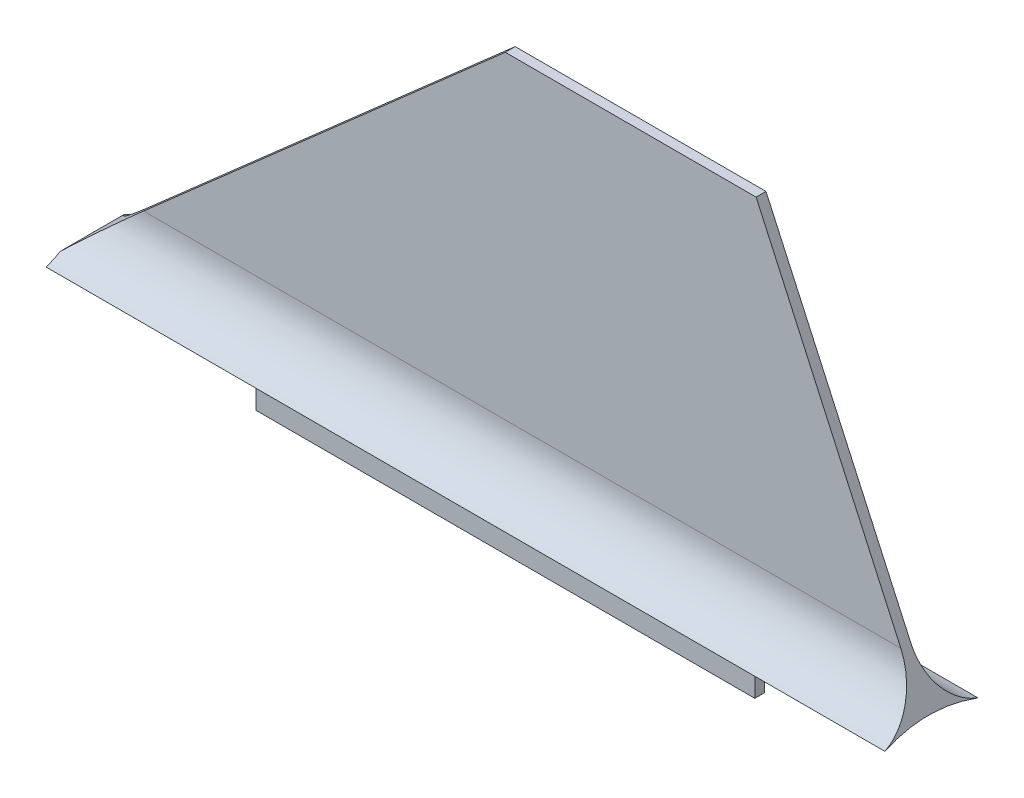
ISO-10303-21;
HEADER;
FILE_DESCRIPTION(('STEP AP214'),'2;1');
FILE_NAME('part.step','',(''),(''),'','','');
FILE_SCHEMA(('AUTOMOTIVE_DESIGN { 1 0 10303 214 1 1 1 1 }'));
ENDSEC;
DATA;
#1=APPLICATION_CONTEXT('core data for automotive mechanical design processes');
#2=APPLICATION_PROTOCOL_DEFINITION('international standard','automotive_design',2000,#1);
#3=PRODUCT_CONTEXT('',#1,'mechanical');
#4=PRODUCT('Part','Part','',(#3));
#5=PRODUCT_RELATED_PRODUCT_CATEGORY('part','',(#4));
#6=PRODUCT_DEFINITION_FORMATION('','',#4);
#7=PRODUCT_DEFINITION_CONTEXT('part definition',#1,'design');
#8=PRODUCT_DEFINITION('design','',#6,#7);
#9=PRODUCT_DEFINITION_SHAPE('','',#8);
#10=(LENGTH_UNIT() NAMED_UNIT(*) SI_UNIT(.MILLI.,.METRE.));
#11=(NAMED_UNIT(*) PLANE_ANGLE_UNIT() SI_UNIT($,.RADIAN.));
#12=(NAMED_UNIT(*) SI_UNIT($,.STERADIAN.) SOLID_ANGLE_UNIT());
#13=UNCERTAINTY_MEASURE_WITH_UNIT(LENGTH_MEASURE(1.E-05),#10,'distance_accuracy_value','');
#14=(GEOMETRIC_REPRESENTATION_CONTEXT(3) GLOBAL_UNCERTAINTY_ASSIGNED_CONTEXT((#13)) GLOBAL_UNIT_ASSIGNED_CONTEXT((#10,
#11,#12)) REPRESENTATION_CONTEXT('',''));
#15=CARTESIAN_POINT('',(0.,0.,0.));
#16=DIRECTION('',(0.,0.,1.));
#17=DIRECTION('',(1.,0.,0.));
#18=AXIS2_PLACEMENT_3D('',#15,#16,#17);
#19=CARTESIAN_POINT('',(51.1936999999998,-20.32,2.9972));
#20=DIRECTION('',(1.,0.,0.));
#21=DIRECTION('',(0.,1.,0.));
#22=AXIS2_PLACEMENT_3D('',#19,#20,#21);
#23=PLANE('',#22);
#24=DIRECTION('',(0.,0.,-1.));
#25=VECTOR('',#24,1.);
#26=CARTESIAN_POINT('',(51.1937000000007,0.,2.9972));
#27=LINE('',#26,#25);
#28=CARTESIAN_POINT('',(51.1937000000007,0.,2.90847389918444));
#29=VERTEX_POINT('',#28);
#30=CARTESIAN_POINT('',(51.1937000000007,0.,0.0887261008155585));
#31=VERTEX_POINT('',#30);
#32=EDGE_CURVE('E213',#29,#31,#27,.T.);
#33=ORIENTED_EDGE('',*,*,#32,.T.);
#34=CARTESIAN_POINT('',(51.1936999999985,-50.7778908388287,1.4986));
#35=DIRECTION('',(1.,0.,0.));
#36=DIRECTION('',(0.,1.,0.));
#37=AXIS2_PLACEMENT_3D('',#34,#35,#36);
#38=CIRCLE('',#37,50.79746);
#39=CARTESIAN_POINT('',(51.1937000000002,-0.00254110599472168,0.));
#40=VERTEX_POINT('',#39);
#41=EDGE_CURVE('E285',#31,#40,#38,.F.);
#42=ORIENTED_EDGE('',*,*,#41,.T.);
#43=DIRECTION('',(0.,-1.,0.));
#44=VECTOR('',#43,1.);
#45=CARTESIAN_POINT('',(51.1936999999998,-20.32,0.));
#46=LINE('',#45,#44);
#47=CARTESIAN_POINT('',(51.1936999999998,-20.32,0.));
#48=VERTEX_POINT('',#47);
#49=EDGE_CURVE('E250',#40,#48,#46,.T.);
#50=ORIENTED_EDGE('',*,*,#49,.T.);
#51=DIRECTION('',(0.,0.,-1.));
#52=VECTOR('',#51,1.);
#53=CARTESIAN_POINT('',(51.1936999999998,-20.32,2.9972));
#54=LINE('',#53,#52);
#55=CARTESIAN_POINT('',(51.1936999999998,-20.32,2.9972));
#56=VERTEX_POINT('',#55);
#57=EDGE_CURVE('E216',#56,#48,#54,.T.);
#58=ORIENTED_EDGE('',*,*,#57,.F.);
#59=DIRECTION('',(0.,-1.,0.));
#60=VECTOR('',#59,1.);
#61=CARTESIAN_POINT('',(51.1936999999998,-20.32,2.9972));
#62=LINE('',#61,#60);
#63=CARTESIAN_POINT('',(51.1937000000007,-0.00254110599472168,2.9972));
#64=VERTEX_POINT('',#63);
#65=EDGE_CURVE('E240',#64,#56,#62,.T.);
#66=ORIENTED_EDGE('',*,*,#65,.F.);
#67=EDGE_CURVE('E272',#64,#29,#38,.F.);
#68=ORIENTED_EDGE('',*,*,#67,.T.);
#69=EDGE_LOOP('',(#33,#42,#50,#58,#66,#68));
#70=FACE_BOUND('',#69,.T.);
#71=ADVANCED_FACE('F36',(#70),#23,.F.);
#72=CARTESIAN_POINT('',(202.806299999998,0.,2.9972));
#73=DIRECTION('',(-1.,-1.31128703695885E-13,0.));
#74=DIRECTION('',(1.31128703695885E-13,-1.,0.));
#75=AXIS2_PLACEMENT_3D('',#72,#73,#74);
#76=PLANE('',#75);
#77=DIRECTION('',(-1.31128703695885E-13,1.,0.));
#78=VECTOR('',#77,1.);
#79=CARTESIAN_POINT('',(202.806299999998,0.,0.));
#80=LINE('',#79,#78);
#81=CARTESIAN_POINT('',(202.806300000001,-20.32,0.));
#82=VERTEX_POINT('',#81);
#83=CARTESIAN_POINT('',(202.806299999998,-0.00254110599472168,0.));
#84=VERTEX_POINT('',#83);
#85=EDGE_CURVE('E245',#82,#84,#80,.T.);
#86=ORIENTED_EDGE('',*,*,#85,.T.);
#87=CARTESIAN_POINT('',(202.806300000005,-50.7778908388287,1.4986));
#88=DIRECTION('',(-1.,-1.31128703695885E-13,0.));
#89=DIRECTION('',(1.31128703695885E-13,-1.,0.));
#90=AXIS2_PLACEMENT_3D('',#87,#88,#89);
#91=CIRCLE('',#90,50.79746);
#92=CARTESIAN_POINT('',(202.806299999998,0.,0.0887261008155585));
#93=VERTEX_POINT('',#92);
#94=EDGE_CURVE('E288',#84,#93,#91,.F.);
#95=ORIENTED_EDGE('',*,*,#94,.T.);
#96=DIRECTION('',(0.,0.,-1.));
#97=VECTOR('',#96,1.);
#98=CARTESIAN_POINT('',(202.806299999998,0.,2.9972));
#99=LINE('',#98,#97);
#100=CARTESIAN_POINT('',(202.806299999998,0.,2.90847389918444));
#101=VERTEX_POINT('',#100);
#102=EDGE_CURVE('E222',#101,#93,#99,.T.);
#103=ORIENTED_EDGE('',*,*,#102,.F.);
#104=CARTESIAN_POINT('',(202.806299999999,-0.00254110599472168,2.9972));
#105=VERTEX_POINT('',#104);
#106=EDGE_CURVE('E269',#101,#105,#91,.F.);
#107=ORIENTED_EDGE('',*,*,#106,.T.);
#108=DIRECTION('',(-1.31128703695885E-13,1.,0.));
#109=VECTOR('',#108,1.);
#110=CARTESIAN_POINT('',(202.806299999998,0.,2.9972));
#111=LINE('',#110,#109);
#112=CARTESIAN_POINT('',(202.806300000001,-20.32,2.9972));
#113=VERTEX_POINT('',#112);
#114=EDGE_CURVE('E259',#113,#105,#111,.T.);
#115=ORIENTED_EDGE('',*,*,#114,.F.);
#116=DIRECTION('',(0.,0.,-1.));
#117=VECTOR('',#116,1.);
#118=CARTESIAN_POINT('',(202.806300000001,-20.32,2.9972));
#119=LINE('',#118,#117);
#120=EDGE_CURVE('E219',#113,#82,#119,.T.);
#121=ORIENTED_EDGE('',*,*,#120,.T.);
#122=EDGE_LOOP('',(#86,#95,#103,#107,#115,#121));
#123=FACE_BOUND('',#122,.T.);
#124=ADVANCED_FACE('F343',(#123),#76,.F.);
#125=CARTESIAN_POINT('',(0.,0.,2.9972));
#126=DIRECTION('',(0.660627894892026,-0.750713516922754,0.));
#127=DIRECTION('',(0.750713516922754,0.660627894892026,0.));
#128=AXIS2_PLACEMENT_3D('',#125,#126,#127);
#129=PLANE('',#128);
#130=CARTESIAN_POINT('',(-57.7021486804868,-50.7778908388287,1.4986));
#131=DIRECTION('',(0.660627894892026,-0.750713516922754,0.));
#132=DIRECTION('',(-0.750713516922754,-0.660627894892026,0.));
#133=AXIS2_PLACEMENT_3D('',#130,#131,#132);
#134=ELLIPSE('',#133,76.8965409919646,50.8);
#135=CARTESIAN_POINT('',(0.,0.,2.9972));
#136=VERTEX_POINT('',#135);
#137=CARTESIAN_POINT('',(0.,0.,0.));
#138=VERTEX_POINT('',#137);
#139=EDGE_CURVE('E252',#136,#138,#134,.F.);
#140=ORIENTED_EDGE('',*,*,#139,.F.);
#141=DIRECTION('',(0.,0.,1.));
#142=VECTOR('',#141,1.);
#143=CARTESIAN_POINT('',(0.,0.,2.9972));
#144=LINE('',#143,#142);
#145=CARTESIAN_POINT('',(0.,0.,11.2851642384052));
#146=VERTEX_POINT('',#145);
#147=EDGE_CURVE('E11',#136,#146,#144,.T.);
#148=ORIENTED_EDGE('',*,*,#147,.T.);
#149=CARTESIAN_POINT('',(17.0844121892146,15.0342827265089,20.7772));
#150=DIRECTION('',(0.660627894892026,-0.750713516922754,0.));
#151=DIRECTION('',(-0.750713516922754,-0.660627894892026,0.));
#152=AXIS2_PLACEMENT_3D('',#149,#150,#151);
#153=ELLIPSE('',#152,26.9137893471876,17.78);
#154=CARTESIAN_POINT('',(17.0844121892146,15.0342827265089,2.9972));
#155=VERTEX_POINT('',#154);
#156=EDGE_CURVE('E182',#146,#155,#153,.T.);
#157=ORIENTED_EDGE('',*,*,#156,.T.);
#158=DIRECTION('',(-0.750713516922754,-0.660627894892026,0.));
#159=VECTOR('',#158,1.);
#160=CARTESIAN_POINT('',(0.,0.,2.9972));
#161=LINE('',#160,#159);
#162=CARTESIAN_POINT('',(127.,111.76,2.9972));
#163=VERTEX_POINT('',#162);
#164=EDGE_CURVE('E237',#163,#155,#161,.T.);
#165=ORIENTED_EDGE('',*,*,#164,.F.);
#166=DIRECTION('',(0.,0.,-1.));
#167=VECTOR('',#166,1.);
#168=CARTESIAN_POINT('',(127.,111.76,2.9972));
#169=LINE('',#168,#167);
#170=CARTESIAN_POINT('',(127.,111.76,0.));
#171=VERTEX_POINT('',#170);
#172=EDGE_CURVE('E231',#163,#171,#169,.T.);
#173=ORIENTED_EDGE('',*,*,#172,.T.);
#174=DIRECTION('',(-0.750713516922754,-0.660627894892026,0.));
#175=VECTOR('',#174,1.);
#176=CARTESIAN_POINT('',(0.,0.,0.));
#177=LINE('',#176,#175);
#178=CARTESIAN_POINT('',(17.086759439614,15.0363483068604,0.));
#179=VERTEX_POINT('',#178);
#180=EDGE_CURVE('E238',#171,#179,#177,.T.);
#181=ORIENTED_EDGE('',*,*,#180,.T.);
#182=CARTESIAN_POINT('',(17.086759439614,15.0363483068604,-17.78));
#183=DIRECTION('',(0.660627894892026,-0.750713516922754,0.));
#184=DIRECTION('',(-0.750713516922754,-0.660627894892026,0.));
#185=AXIS2_PLACEMENT_3D('',#182,#183,#184);
#186=ELLIPSE('',#185,26.9137893471876,17.78);
#187=CARTESIAN_POINT('',(0.,0.,-8.29123666673176));
#188=VERTEX_POINT('',#187);
#189=EDGE_CURVE('E58',#179,#188,#186,.T.);
#190=ORIENTED_EDGE('',*,*,#189,.T.);
#191=DIRECTION('',(0.,0.,-1.));
#192=VECTOR('',#191,1.);
#193=CARTESIAN_POINT('',(0.,0.,1.4986));
#194=LINE('',#193,#192);
#195=EDGE_CURVE('E44',#138,#188,#194,.T.);
#196=ORIENTED_EDGE('',*,*,#195,.F.);
#197=EDGE_LOOP('',(#140,#148,#157,#165,#173,#181,#190,#196));
#198=FACE_BOUND('',#197,.T.);
#199=ADVANCED_FACE('F368',(#198),#129,.F.);
#200=CARTESIAN_POINT('',(0.,0.,2.9972));
#201=DIRECTION('',(0.,0.,1.));
#202=DIRECTION('',(1.,0.,0.));
#203=AXIS2_PLACEMENT_3D('',#200,#201,#202);
#204=PLANE('',#203);
#205=ORIENTED_EDGE('',*,*,#164,.T.);
#206=DIRECTION('',(1.,0.,0.));
#207=VECTOR('',#206,1.);
#208=CARTESIAN_POINT('',(254.000000000001,15.0342827265089,2.9972));
#209=LINE('',#208,#207);
#210=CARTESIAN_POINT('',(247.166235124315,15.0342827265089,2.9972));
#211=VERTEX_POINT('',#210);
#212=EDGE_CURVE('E205',#155,#211,#209,.T.);
#213=ORIENTED_EDGE('',*,*,#212,.T.);
#214=DIRECTION('',(-0.413802944301199,0.910366477462598,0.));
#215=VECTOR('',#214,1.);
#216=CARTESIAN_POINT('',(203.199999999999,111.76,2.9972));
#217=LINE('',#216,#215);
#218=CARTESIAN_POINT('',(203.199999999999,111.76,2.9972));
#219=VERTEX_POINT('',#218);
#220=EDGE_CURVE('E257',#211,#219,#217,.T.);
#221=ORIENTED_EDGE('',*,*,#220,.T.);
#222=DIRECTION('',(-1.,0.,0.));
#223=VECTOR('',#222,1.);
#224=CARTESIAN_POINT('',(127.,111.76,2.9972));
#225=LINE('',#224,#223);
#226=EDGE_CURVE('E255',#219,#163,#225,.T.);
#227=ORIENTED_EDGE('',*,*,#226,.T.);
#228=EDGE_LOOP('',(#205,#213,#221,#227));
#229=FACE_BOUND('',#228,.T.);
#230=ADVANCED_FACE('F390',(#229),#204,.T.);
#231=CARTESIAN_POINT('',(0.,0.,0.));
#232=DIRECTION('',(0.,0.,1.));
#233=DIRECTION('',(1.,0.,0.));
#234=AXIS2_PLACEMENT_3D('',#231,#232,#233);
#235=PLANE('',#234);
#236=DIRECTION('',(-0.413802944301199,0.910366477462598,0.));
#237=VECTOR('',#236,1.);
#238=CARTESIAN_POINT('',(203.199999999999,111.76,0.));
#239=LINE('',#238,#237);
#240=CARTESIAN_POINT('',(247.165296224155,15.0363483068604,0.));
#241=VERTEX_POINT('',#240);
#242=CARTESIAN_POINT('',(203.199999999999,111.76,0.));
#243=VERTEX_POINT('',#242);
#244=EDGE_CURVE('E243',#241,#243,#239,.T.);
#245=ORIENTED_EDGE('',*,*,#244,.F.);
#246=DIRECTION('',(-1.,0.,0.));
#247=VECTOR('',#246,1.);
#248=CARTESIAN_POINT('',(0.,15.0363483068604,0.));
#249=LINE('',#248,#247);
#250=EDGE_CURVE('E208',#241,#179,#249,.T.);
#251=ORIENTED_EDGE('',*,*,#250,.T.);
#252=ORIENTED_EDGE('',*,*,#180,.F.);
#253=DIRECTION('',(-1.,0.,0.));
#254=VECTOR('',#253,1.);
#255=CARTESIAN_POINT('',(127.,111.76,0.));
#256=LINE('',#255,#254);
#257=EDGE_CURVE('E241',#243,#171,#256,.T.);
#258=ORIENTED_EDGE('',*,*,#257,.F.);
#259=EDGE_LOOP('',(#245,#251,#252,#258));
#260=FACE_BOUND('',#259,.T.);
#261=ADVANCED_FACE('F360',(#260),#235,.F.);
#262=CARTESIAN_POINT('',(51.1937000000007,0.,2.9972));
#263=DIRECTION('',(0.,1.,0.));
#264=DIRECTION('',(0.,0.,1.));
#265=AXIS2_PLACEMENT_3D('',#262,#263,#264);
#266=PLANE('',#265);
#267=DIRECTION('',(0.,0.,-1.));
#268=VECTOR('',#267,1.);
#269=CARTESIAN_POINT('',(0.,0.,2.9972));
#270=LINE('',#269,#268);
#271=CARTESIAN_POINT('',(0.,0.,2.90847389918398));
#272=VERTEX_POINT('',#271);
#273=CARTESIAN_POINT('',(0.,0.,0.0887261008160195));
#274=VERTEX_POINT('',#273);
#275=EDGE_CURVE('E234',#272,#274,#270,.T.);
#276=ORIENTED_EDGE('',*,*,#275,.T.);
#277=DIRECTION('',(-1.,0.,0.));
#278=VECTOR('',#277,1.);
#279=CARTESIAN_POINT('',(284.162631533096,0.,0.0887261008155585));
#280=LINE('',#279,#278);
#281=EDGE_CURVE('E282',#274,#31,#280,.F.);
#282=ORIENTED_EDGE('',*,*,#281,.T.);
#283=ORIENTED_EDGE('',*,*,#32,.F.);
#284=DIRECTION('',(-1.,0.,0.));
#285=VECTOR('',#284,1.);
#286=CARTESIAN_POINT('',(284.162631533096,0.,2.90847389918444));
#287=LINE('',#286,#285);
#288=EDGE_CURVE('E273',#29,#272,#287,.T.);
#289=ORIENTED_EDGE('',*,*,#288,.T.);
#290=EDGE_LOOP('',(#276,#282,#283,#289));
#291=FACE_BOUND('',#290,.T.);
#292=ADVANCED_FACE('F326',(#291),#266,.F.);
#293=CARTESIAN_POINT('',(202.806300000001,-20.32,2.9972));
#294=DIRECTION('',(0.,1.,0.));
#295=DIRECTION('',(0.,0.,1.));
#296=AXIS2_PLACEMENT_3D('',#293,#294,#295);
#297=PLANE('',#296);
#298=DIRECTION('',(1.,0.,0.));
#299=VECTOR('',#298,1.);
#300=CARTESIAN_POINT('',(202.806300000001,-20.32,0.));
#301=LINE('',#300,#299);
#302=EDGE_CURVE('E248',#48,#82,#301,.T.);
#303=ORIENTED_EDGE('',*,*,#302,.T.);
#304=ORIENTED_EDGE('',*,*,#120,.F.);
#305=DIRECTION('',(1.,0.,0.));
#306=VECTOR('',#305,1.);
#307=CARTESIAN_POINT('',(202.806300000001,-20.32,2.9972));
#308=LINE('',#307,#306);
#309=EDGE_CURVE('E262',#56,#113,#308,.T.);
#310=ORIENTED_EDGE('',*,*,#309,.F.);
#311=ORIENTED_EDGE('',*,*,#57,.T.);
#312=EDGE_LOOP('',(#303,#304,#310,#311));
#313=FACE_BOUND('',#312,.T.);
#314=ADVANCED_FACE('F352',(#313),#297,.F.);
#315=CARTESIAN_POINT('',(254.000000000001,0.,2.9972));
#316=DIRECTION('',(0.,1.,0.));
#317=DIRECTION('',(0.,0.,1.));
#318=AXIS2_PLACEMENT_3D('',#315,#316,#317);
#319=PLANE('',#318);
#320=ORIENTED_EDGE('',*,*,#102,.T.);
#321=DIRECTION('',(-1.,0.,0.));
#322=VECTOR('',#321,1.);
#323=CARTESIAN_POINT('',(284.162631533096,0.,0.0887261008160195));
#324=LINE('',#323,#322);
#325=CARTESIAN_POINT('',(254.000000000001,0.,0.08872610081583));
#326=VERTEX_POINT('',#325);
#327=EDGE_CURVE('E276',#93,#326,#324,.F.);
#328=ORIENTED_EDGE('',*,*,#327,.T.);
#329=DIRECTION('',(0.,0.,-1.));
#330=VECTOR('',#329,1.);
#331=CARTESIAN_POINT('',(254.000000000001,0.,2.9972));
#332=LINE('',#331,#330);
#333=CARTESIAN_POINT('',(254.000000000001,0.,2.90847389918418));
#334=VERTEX_POINT('',#333);
#335=EDGE_CURVE('E225',#334,#326,#332,.T.);
#336=ORIENTED_EDGE('',*,*,#335,.F.);
#337=DIRECTION('',(-1.,0.,0.));
#338=VECTOR('',#337,1.);
#339=CARTESIAN_POINT('',(284.162631533096,0.,2.90847389918398));
#340=LINE('',#339,#338);
#341=EDGE_CURVE('E266',#334,#101,#340,.T.);
#342=ORIENTED_EDGE('',*,*,#341,.T.);
#343=EDGE_LOOP('',(#320,#328,#336,#342));
#344=FACE_BOUND('',#343,.T.);
#345=ADVANCED_FACE('F345',(#344),#319,.F.);
#346=CARTESIAN_POINT('',(203.199999999999,111.76,2.9972));
#347=DIRECTION('',(-0.910366477462598,-0.413802944301199,0.));
#348=DIRECTION('',(0.413802944301199,-0.910366477462598,0.));
#349=AXIS2_PLACEMENT_3D('',#346,#347,#348);
#350=PLANE('',#349);
#351=ORIENTED_EDGE('',*,*,#220,.F.);
#352=CARTESIAN_POINT('',(247.166235124315,15.0342827265089,20.7772));
#353=DIRECTION('',(-0.910366477462598,-0.413802944301199,0.));
#354=DIRECTION('',(-0.413802944301199,0.910366477462598,0.));
#355=AXIS2_PLACEMENT_3D('',#352,#353,#354);
#356=ELLIPSE('',#355,19.5305961282285,17.78);
#357=CARTESIAN_POINT('',(254.890236641807,-1.95852061197227,15.545275430618));
#358=VERTEX_POINT('',#357);
#359=EDGE_CURVE('E183',#211,#358,#356,.T.);
#360=ORIENTED_EDGE('',*,*,#359,.T.);
#361=DIRECTION('',(0.400298264867158,-0.880656182707709,-0.253389003319064));
#362=VECTOR('',#361,1.);
#363=CARTESIAN_POINT('',(259.581738911434,-12.2798256051509,12.5755521305073));
#364=LINE('',#363,#362);
#365=CARTESIAN_POINT('',(254.891346172948,-1.96096158048362,15.5445730968465));
#366=VERTEX_POINT('',#365);
#367=EDGE_CURVE('E167',#358,#366,#364,.T.);
#368=ORIENTED_EDGE('',*,*,#367,.T.);
#369=CARTESIAN_POINT('',(277.080859472197,-50.7778908388287,1.4986));
#370=DIRECTION('',(-0.910366477462598,-0.413802944301199,0.));
#371=DIRECTION('',(-0.413802944301199,0.910366477462598,0.));
#372=AXIS2_PLACEMENT_3D('',#369,#370,#371);
#373=ELLIPSE('',#372,55.7989131383487,50.79746);
#374=EDGE_CURVE('E306',#366,#334,#373,.T.);
#375=ORIENTED_EDGE('',*,*,#374,.T.);
#376=ORIENTED_EDGE('',*,*,#335,.T.);
#377=CARTESIAN_POINT('',(254.911331114431,-2.00492845174584,-12.69929007));
#378=VERTEX_POINT('',#377);
#379=EDGE_CURVE('E169',#326,#378,#373,.T.);
#380=ORIENTED_EDGE('',*,*,#379,.T.);
#381=DIRECTION('',(-0.399995441999712,0.879989972399328,-0.256166537346479));
#382=VECTOR('',#381,1.);
#383=CARTESIAN_POINT('',(259.590501349285,-12.2991029684243,-9.70263883136378));
#384=LINE('',#383,#382);
#385=CARTESIAN_POINT('',(254.910222582587,-2.00248968168799,-12.7));
#386=VERTEX_POINT('',#385);
#387=EDGE_CURVE('E291',#378,#386,#384,.T.);
#388=ORIENTED_EDGE('',*,*,#387,.T.);
#389=CARTESIAN_POINT('',(247.165296224155,15.0363483068604,-17.78));
#390=DIRECTION('',(-0.910366477462598,-0.413802944301199,0.));
#391=DIRECTION('',(-0.413802944301199,0.910366477462598,0.));
#392=AXIS2_PLACEMENT_3D('',#389,#390,#391);
#393=ELLIPSE('',#392,19.5305961282285,17.78);
#394=EDGE_CURVE('E201',#386,#241,#393,.T.);
#395=ORIENTED_EDGE('',*,*,#394,.T.);
#396=ORIENTED_EDGE('',*,*,#244,.T.);
#397=DIRECTION('',(0.,0.,-1.));
#398=VECTOR('',#397,1.);
#399=CARTESIAN_POINT('',(203.199999999999,111.76,2.9972));
#400=LINE('',#399,#398);
#401=EDGE_CURVE('E228',#219,#243,#400,.T.);
#402=ORIENTED_EDGE('',*,*,#401,.F.);
#403=EDGE_LOOP('',(#351,#360,#368,#375,#376,#380,#388,#395,#396,#402));
#404=FACE_BOUND('',#403,.T.);
#405=ADVANCED_FACE('F313',(#404),#350,.F.);
#406=CARTESIAN_POINT('',(127.,111.76,2.9972));
#407=DIRECTION('',(0.,-1.,0.));
#408=DIRECTION('',(0.,0.,-1.));
#409=AXIS2_PLACEMENT_3D('',#406,#407,#408);
#410=PLANE('',#409);
#411=ORIENTED_EDGE('',*,*,#257,.T.);
#412=ORIENTED_EDGE('',*,*,#172,.F.);
#413=ORIENTED_EDGE('',*,*,#226,.F.);
#414=ORIENTED_EDGE('',*,*,#401,.T.);
#415=EDGE_LOOP('',(#411,#412,#413,#414));
#416=FACE_BOUND('',#415,.T.);
#417=ADVANCED_FACE('F395',(#416),#410,.F.);
#418=ORIENTED_EDGE('',*,*,#275,.F.);
#419=CARTESIAN_POINT('',(-57.7021486804868,-50.7778908388287,1.4986));
#420=DIRECTION('',(0.660627894892026,-0.750713516922754,0.));
#421=DIRECTION('',(-0.750713516922754,-0.660627894892026,0.));
#422=AXIS2_PLACEMENT_3D('',#419,#420,#421);
#423=ELLIPSE('',#422,76.892696164915,50.79746);
#424=EDGE_CURVE('E279',#272,#274,#423,.F.);
#425=ORIENTED_EDGE('',*,*,#424,.T.);
#426=EDGE_LOOP('',(#418,#425));
#427=FACE_BOUND('',#426,.T.);
#428=ADVANCED_FACE('F323',(#427),#129,.F.);
#429=DIRECTION('',(-1.,0.,0.));
#430=VECTOR('',#429,1.);
#431=CARTESIAN_POINT('',(284.162631533096,-0.00254110599472168,2.9972));
#432=LINE('',#431,#430);
#433=EDGE_CURVE('E270',#64,#105,#432,.F.);
#434=ORIENTED_EDGE('',*,*,#433,.F.);
#435=ORIENTED_EDGE('',*,*,#65,.T.);
#436=ORIENTED_EDGE('',*,*,#309,.T.);
#437=ORIENTED_EDGE('',*,*,#114,.T.);
#438=EDGE_LOOP('',(#434,#435,#436,#437));
#439=FACE_BOUND('',#438,.T.);
#440=ADVANCED_FACE('F337',(#439),#204,.T.);
#441=ORIENTED_EDGE('',*,*,#49,.F.);
#442=DIRECTION('',(-1.,0.,0.));
#443=VECTOR('',#442,1.);
#444=CARTESIAN_POINT('',(284.162631533096,-0.00254110599472168,0.));
#445=LINE('',#444,#443);
#446=EDGE_CURVE('E210',#40,#84,#445,.F.);
#447=ORIENTED_EDGE('',*,*,#446,.T.);
#448=ORIENTED_EDGE('',*,*,#85,.F.);
#449=ORIENTED_EDGE('',*,*,#302,.F.);
#450=EDGE_LOOP('',(#441,#447,#448,#449));
#451=FACE_BOUND('',#450,.T.);
#452=ADVANCED_FACE('F349',(#451),#235,.F.);
#453=CARTESIAN_POINT('',(284.162631533096,-50.7778908388287,1.4986));
#454=DIRECTION('',(-1.,0.,0.));
#455=DIRECTION('',(0.,0.,1.));
#456=AXIS2_PLACEMENT_3D('',#453,#454,#455);
#457=CYLINDRICAL_SURFACE('',#456,50.8);
#458=CARTESIAN_POINT('',(0.,-50.7778908388287,1.4986));
#459=DIRECTION('',(1.,0.,0.));
#460=DIRECTION('',(0.,0.,-1.));
#461=AXIS2_PLACEMENT_3D('',#458,#459,#460);
#462=CIRCLE('',#461,50.8);
#463=EDGE_CURVE('E178',#138,#136,#462,.T.);
#464=ORIENTED_EDGE('',*,*,#463,.T.);
#465=ORIENTED_EDGE('',*,*,#139,.T.);
#466=EDGE_LOOP('',(#464,#465));
#467=FACE_BOUND('',#466,.T.);
#468=ADVANCED_FACE('F382',(#467),#457,.T.);
#469=CARTESIAN_POINT('',(284.162631533096,-50.7778908388287,1.4986));
#470=DIRECTION('',(-1.,0.,0.));
#471=DIRECTION('',(0.,0.,1.));
#472=AXIS2_PLACEMENT_3D('',#469,#470,#471);
#473=CYLINDRICAL_SURFACE('',#472,50.79746);
#474=ORIENTED_EDGE('',*,*,#341,.F.);
#475=ORIENTED_EDGE('',*,*,#374,.F.);
#476=DIRECTION('',(-1.,0.,0.));
#477=VECTOR('',#476,1.);
#478=CARTESIAN_POINT('',(284.162631533096,-1.96096158048362,15.5445730968465));
#479=LINE('',#478,#477);
#480=CARTESIAN_POINT('',(0.,-1.96096158048362,15.5445730968465));
#481=VERTEX_POINT('',#480);
#482=EDGE_CURVE('E170',#366,#481,#479,.T.);
#483=ORIENTED_EDGE('',*,*,#482,.T.);
#484=CARTESIAN_POINT('',(0.,-50.7778908388287,1.4986));
#485=DIRECTION('',(1.,0.,0.));
#486=DIRECTION('',(0.,0.,-1.));
#487=AXIS2_PLACEMENT_3D('',#484,#485,#486);
#488=CIRCLE('',#487,50.79746);
#489=EDGE_CURVE('E176',#272,#481,#488,.T.);
#490=ORIENTED_EDGE('',*,*,#489,.F.);
#491=ORIENTED_EDGE('',*,*,#288,.F.);
#492=ORIENTED_EDGE('',*,*,#67,.F.);
#493=ORIENTED_EDGE('',*,*,#433,.T.);
#494=ORIENTED_EDGE('',*,*,#106,.F.);
#495=EDGE_LOOP('',(#474,#475,#483,#490,#491,#492,#493,#494));
#496=FACE_BOUND('',#495,.T.);
#497=ADVANCED_FACE('F330',(#496),#473,.F.);
#498=ORIENTED_EDGE('',*,*,#327,.F.);
#499=ORIENTED_EDGE('',*,*,#94,.F.);
#500=ORIENTED_EDGE('',*,*,#446,.F.);
#501=ORIENTED_EDGE('',*,*,#41,.F.);
#502=ORIENTED_EDGE('',*,*,#281,.F.);
#503=CARTESIAN_POINT('',(0.,-2.00492845174585,-12.69929007));
#504=VERTEX_POINT('',#503);
#505=EDGE_CURVE('E300',#504,#274,#488,.T.);
#506=ORIENTED_EDGE('',*,*,#505,.F.);
#507=DIRECTION('',(-1.,0.,0.));
#508=VECTOR('',#507,1.);
#509=CARTESIAN_POINT('',(284.162631533096,-2.00492845174585,-12.69929007));
#510=LINE('',#509,#508);
#511=EDGE_CURVE('E295',#378,#504,#510,.T.);
#512=ORIENTED_EDGE('',*,*,#511,.F.);
#513=ORIENTED_EDGE('',*,*,#379,.F.);
#514=EDGE_LOOP('',(#498,#499,#500,#501,#502,#506,#512,#513));
#515=FACE_BOUND('',#514,.T.);
#516=ADVANCED_FACE('F317',(#515),#473,.F.);
#517=ORIENTED_EDGE('',*,*,#424,.F.);
#518=EDGE_CURVE('E302',#274,#272,#488,.T.);
#519=ORIENTED_EDGE('',*,*,#518,.F.);
#520=EDGE_LOOP('',(#517,#519));
#521=FACE_BOUND('',#520,.T.);
#522=ADVANCED_FACE('F383',(#521),#473,.F.);
#523=CARTESIAN_POINT('',(0.,-50.7778908388287,1.4986));
#524=DIRECTION('',(1.,0.,0.));
#525=DIRECTION('',(0.,0.,-1.));
#526=AXIS2_PLACEMENT_3D('',#523,#524,#525);
#527=PLANE('',#526);
#528=ORIENTED_EDGE('',*,*,#463,.F.);
#529=ORIENTED_EDGE('',*,*,#195,.T.);
#530=CARTESIAN_POINT('',(0.,15.0363483068604,-17.78));
#531=DIRECTION('',(1.,0.,0.));
#532=DIRECTION('',(0.,0.,-1.));
#533=AXIS2_PLACEMENT_3D('',#530,#531,#532);
#534=CIRCLE('',#533,17.78);
#535=CARTESIAN_POINT('',(0.,-2.00248968168799,-12.7));
#536=VERTEX_POINT('',#535);
#537=EDGE_CURVE('E186',#188,#536,#534,.T.);
#538=ORIENTED_EDGE('',*,*,#537,.T.);
#539=DIRECTION('',(0.,-0.960145692069692,0.279500000000022));
#540=VECTOR('',#539,1.);
#541=CARTESIAN_POINT('',(0.,-2.00248968168799,-12.7));
#542=LINE('',#541,#540);
#543=EDGE_CURVE('E298',#536,#504,#542,.T.);
#544=ORIENTED_EDGE('',*,*,#543,.T.);
#545=ORIENTED_EDGE('',*,*,#505,.T.);
#546=ORIENTED_EDGE('',*,*,#518,.T.);
#547=ORIENTED_EDGE('',*,*,#489,.T.);
#548=DIRECTION('',(0.,0.961011224938205,0.276509358870131));
#549=VECTOR('',#548,1.);
#550=CARTESIAN_POINT('',(0.,-1.96096158048362,15.5445730968465));
#551=LINE('',#550,#549);
#552=CARTESIAN_POINT('',(0.,-1.95852061197227,15.545275430618));
#553=VERTEX_POINT('',#552);
#554=EDGE_CURVE('E166',#481,#553,#551,.T.);
#555=ORIENTED_EDGE('',*,*,#554,.T.);
#556=CARTESIAN_POINT('',(0.,15.0342827265089,20.7772));
#557=DIRECTION('',(1.,0.,0.));
#558=DIRECTION('',(0.,0.,-1.));
#559=AXIS2_PLACEMENT_3D('',#556,#557,#558);
#560=CIRCLE('',#559,17.78);
#561=EDGE_CURVE('E51',#553,#146,#560,.T.);
#562=ORIENTED_EDGE('',*,*,#561,.T.);
#563=ORIENTED_EDGE('',*,*,#147,.F.);
#564=EDGE_LOOP('',(#528,#529,#538,#544,#545,#546,#547,#555,#562,#563));
#565=FACE_BOUND('',#564,.T.);
#566=ADVANCED_FACE('F173',(#565),#527,.F.);
#567=CARTESIAN_POINT('',(284.162631533096,-1.96096158048362,15.5445730968465));
#568=DIRECTION('',(0.,-0.27650935887013,0.961011224938205));
#569=DIRECTION('',(0.,-0.961011224938205,-0.276509358870131));
#570=AXIS2_PLACEMENT_3D('',#567,#568,#569);
#571=PLANE('',#570);
#572=ORIENTED_EDGE('',*,*,#367,.F.);
#573=DIRECTION('',(-1.,0.,0.));
#574=VECTOR('',#573,1.);
#575=CARTESIAN_POINT('',(284.162631533096,-1.95852061197227,15.545275430618));
#576=LINE('',#575,#574);
#577=EDGE_CURVE('E163',#358,#553,#576,.T.);
#578=ORIENTED_EDGE('',*,*,#577,.T.);
#579=ORIENTED_EDGE('',*,*,#554,.F.);
#580=ORIENTED_EDGE('',*,*,#482,.F.);
#581=EDGE_LOOP('',(#572,#578,#579,#580));
#582=FACE_BOUND('',#581,.T.);
#583=ADVANCED_FACE('F164',(#582),#571,.T.);
#584=CARTESIAN_POINT('',(284.162631533096,-2.00248968168799,-12.7));
#585=DIRECTION('',(0.,-0.279500000000022,-0.960145692069692));
#586=DIRECTION('',(0.,0.960145692069692,-0.279500000000022));
#587=AXIS2_PLACEMENT_3D('',#584,#585,#586);
#588=PLANE('',#587);
#589=ORIENTED_EDGE('',*,*,#387,.F.);
#590=ORIENTED_EDGE('',*,*,#511,.T.);
#591=ORIENTED_EDGE('',*,*,#543,.F.);
#592=DIRECTION('',(-1.,0.,0.));
#593=VECTOR('',#592,1.);
#594=CARTESIAN_POINT('',(284.162631533096,-2.00248968168799,-12.7));
#595=LINE('',#594,#593);
#596=EDGE_CURVE('E200',#386,#536,#595,.T.);
#597=ORIENTED_EDGE('',*,*,#596,.F.);
#598=EDGE_LOOP('',(#589,#590,#591,#597));
#599=FACE_BOUND('',#598,.T.);
#600=ADVANCED_FACE('F319',(#599),#588,.T.);
#601=CARTESIAN_POINT('',(284.162631533096,15.0363483068604,-17.78));
#602=DIRECTION('',(-1.,0.,0.));
#603=DIRECTION('',(0.,0.,1.));
#604=AXIS2_PLACEMENT_3D('',#601,#602,#603);
#605=CYLINDRICAL_SURFACE('',#604,17.78);
#606=ORIENTED_EDGE('',*,*,#189,.F.);
#607=ORIENTED_EDGE('',*,*,#250,.F.);
#608=ORIENTED_EDGE('',*,*,#394,.F.);
#609=ORIENTED_EDGE('',*,*,#596,.T.);
#610=ORIENTED_EDGE('',*,*,#537,.F.);
#611=EDGE_LOOP('',(#606,#607,#608,#609,#610));
#612=FACE_BOUND('',#611,.T.);
#613=ADVANCED_FACE('F197',(#612),#605,.F.);
#614=CARTESIAN_POINT('',(284.162631533096,15.0342827265089,20.7772));
#615=DIRECTION('',(-1.,0.,0.));
#616=DIRECTION('',(0.,0.,1.));
#617=AXIS2_PLACEMENT_3D('',#614,#615,#616);
#618=CYLINDRICAL_SURFACE('',#617,17.78);
#619=ORIENTED_EDGE('',*,*,#561,.F.);
#620=ORIENTED_EDGE('',*,*,#577,.F.);
#621=ORIENTED_EDGE('',*,*,#359,.F.);
#622=ORIENTED_EDGE('',*,*,#212,.F.);
#623=ORIENTED_EDGE('',*,*,#156,.F.);
#624=EDGE_LOOP('',(#619,#620,#621,#622,#623));
#625=FACE_BOUND('',#624,.T.);
#626=ADVANCED_FACE('F38',(#625),#618,.F.);
#627=CLOSED_SHELL('',(#71,#124,#199,#230,#261,#292,#314,#345,#405,#417,#428,#440,#452,#468,#497,
#516,#522,#566,#583,#600,#613,#626));
#628=MANIFOLD_SOLID_BREP('B2',#627);
#629=ADVANCED_BREP_SHAPE_REPRESENTATION('',(#18,#628),#14);
#630=SHAPE_DEFINITION_REPRESENTATION(#9,#629);
ENDSEC;
END-ISO-10303-21;
